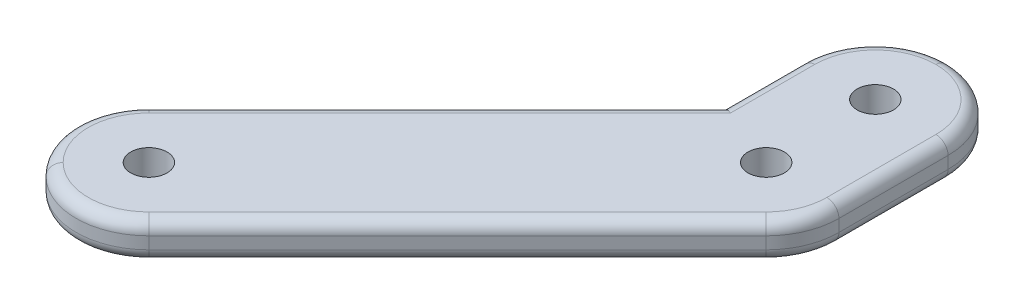
ISO-10303-21;
HEADER;
FILE_DESCRIPTION(('STEP AP214'),'2;1');
FILE_NAME('part.step','',(''),(''),'','','');
FILE_SCHEMA(('AUTOMOTIVE_DESIGN { 1 0 10303 214 1 1 1 1 }'));
ENDSEC;
DATA;
#1=APPLICATION_CONTEXT('core data for automotive mechanical design processes');
#2=APPLICATION_PROTOCOL_DEFINITION('international standard','automotive_design',2000,#1);
#3=PRODUCT_CONTEXT('',#1,'mechanical');
#4=PRODUCT('Part','Part','',(#3));
#5=PRODUCT_RELATED_PRODUCT_CATEGORY('part','',(#4));
#6=PRODUCT_DEFINITION_FORMATION('','',#4);
#7=PRODUCT_DEFINITION_CONTEXT('part definition',#1,'design');
#8=PRODUCT_DEFINITION('design','',#6,#7);
#9=PRODUCT_DEFINITION_SHAPE('','',#8);
#10=(LENGTH_UNIT() NAMED_UNIT(*) SI_UNIT(.MILLI.,.METRE.));
#11=(NAMED_UNIT(*) PLANE_ANGLE_UNIT() SI_UNIT($,.RADIAN.));
#12=(NAMED_UNIT(*) SI_UNIT($,.STERADIAN.) SOLID_ANGLE_UNIT());
#13=UNCERTAINTY_MEASURE_WITH_UNIT(LENGTH_MEASURE(1.E-05),#10,'distance_accuracy_value','');
#14=(GEOMETRIC_REPRESENTATION_CONTEXT(3) GLOBAL_UNCERTAINTY_ASSIGNED_CONTEXT((#13)) GLOBAL_UNIT_ASSIGNED_CONTEXT((#10,
#11,#12)) REPRESENTATION_CONTEXT('',''));
#15=CARTESIAN_POINT('',(0.,0.,0.));
#16=DIRECTION('',(0.,0.,1.));
#17=DIRECTION('',(1.,0.,0.));
#18=AXIS2_PLACEMENT_3D('',#15,#16,#17);
#19=CARTESIAN_POINT('',(9.25262806053457,6.35,9.25262806053447));
#20=DIRECTION('',(-0.707106781186551,0.,-0.707106781186544));
#21=DIRECTION('',(-0.707106781186544,0.,0.707106781186551));
#22=AXIS2_PLACEMENT_3D('',#19,#20,#21);
#23=PLANE('',#22);
#24=DIRECTION('',(0.,-1.,0.));
#25=VECTOR('',#24,1.);
#26=CARTESIAN_POINT('',(-44.9012806053454,6.35,63.406536726415));
#27=LINE('',#26,#25);
#28=CARTESIAN_POINT('',(-44.9012806053454,4.23333333333333,63.406536726415));
#29=VERTEX_POINT('',#28);
#30=CARTESIAN_POINT('',(-44.9012806053454,2.11666666666667,63.406536726415));
#31=VERTEX_POINT('',#30);
#32=EDGE_CURVE('E187',#29,#31,#27,.T.);
#33=ORIENTED_EDGE('',*,*,#32,.T.);
#34=DIRECTION('',(0.707106781186544,0.,-0.707106781186551));
#35=VECTOR('',#34,1.);
#36=CARTESIAN_POINT('',(9.25262806053457,2.11666666666667,9.25262806053447));
#37=LINE('',#36,#35);
#38=CARTESIAN_POINT('',(8.98025612106921,2.11666666666667,9.52499999999984));
#39=VERTEX_POINT('',#38);
#40=EDGE_CURVE('E233',#31,#39,#37,.T.);
#41=ORIENTED_EDGE('',*,*,#40,.T.);
#42=DIRECTION('',(0.,-1.,0.));
#43=VECTOR('',#42,1.);
#44=CARTESIAN_POINT('',(8.98025612106921,6.35,9.52499999999984));
#45=LINE('',#44,#43);
#46=CARTESIAN_POINT('',(8.98025612106921,4.23333333333333,9.52499999999984));
#47=VERTEX_POINT('',#46);
#48=EDGE_CURVE('E316',#47,#39,#45,.T.);
#49=ORIENTED_EDGE('',*,*,#48,.F.);
#50=DIRECTION('',(0.707106781186544,0.,-0.707106781186551));
#51=VECTOR('',#50,1.);
#52=CARTESIAN_POINT('',(-44.9012806053454,4.23333333333333,63.406536726415));
#53=LINE('',#52,#51);
#54=EDGE_CURVE('E231',#47,#29,#53,.F.);
#55=ORIENTED_EDGE('',*,*,#54,.T.);
#56=EDGE_LOOP('',(#33,#41,#49,#55));
#57=FACE_BOUND('',#56,.T.);
#58=ADVANCED_FACE('F35',(#57),#23,.F.);
#59=CARTESIAN_POINT('',(0.,6.35,0.544743878930734));
#60=DIRECTION('',(0.,-1.,0.));
#61=DIRECTION('',(0.,0.,-1.));
#62=AXIS2_PLACEMENT_3D('',#59,#60,#61);
#63=CYLINDRICAL_SURFACE('',#62,12.7);
#64=ORIENTED_EDGE('',*,*,#48,.T.);
#65=CARTESIAN_POINT('',(0.,2.11666666666667,0.544743878930734));
#66=DIRECTION('',(0.,1.,0.));
#67=DIRECTION('',(0.,0.,1.));
#68=AXIS2_PLACEMENT_3D('',#65,#66,#67);
#69=CIRCLE('',#68,12.7);
#70=CARTESIAN_POINT('',(12.7,2.11666666666667,0.544743878930734));
#71=VERTEX_POINT('',#70);
#72=EDGE_CURVE('E229',#39,#71,#69,.T.);
#73=ORIENTED_EDGE('',*,*,#72,.T.);
#74=DIRECTION('',(0.,-1.,0.));
#75=VECTOR('',#74,1.);
#76=CARTESIAN_POINT('',(12.7,6.35,0.544743878930734));
#77=LINE('',#76,#75);
#78=CARTESIAN_POINT('',(12.7,4.23333333333333,0.544743878930734));
#79=VERTEX_POINT('',#78);
#80=EDGE_CURVE('E335',#79,#71,#77,.T.);
#81=ORIENTED_EDGE('',*,*,#80,.F.);
#82=CARTESIAN_POINT('',(0.,4.23333333333333,0.544743878930734));
#83=DIRECTION('',(0.,1.,0.));
#84=DIRECTION('',(0.,0.,1.));
#85=AXIS2_PLACEMENT_3D('',#82,#83,#84);
#86=CIRCLE('',#85,12.7);
#87=EDGE_CURVE('E227',#79,#47,#86,.F.);
#88=ORIENTED_EDGE('',*,*,#87,.T.);
#89=EDGE_LOOP('',(#64,#73,#81,#88));
#90=FACE_BOUND('',#89,.T.);
#91=ADVANCED_FACE('F331',(#90),#63,.T.);
#92=CARTESIAN_POINT('',(12.7,6.35,0.));
#93=DIRECTION('',(-1.,0.,0.));
#94=DIRECTION('',(0.,0.,1.));
#95=AXIS2_PLACEMENT_3D('',#92,#93,#94);
#96=PLANE('',#95);
#97=ORIENTED_EDGE('',*,*,#80,.T.);
#98=DIRECTION('',(0.,0.,-1.));
#99=VECTOR('',#98,1.);
#100=CARTESIAN_POINT('',(12.7,2.11666666666667,0.));
#101=LINE('',#100,#99);
#102=CARTESIAN_POINT('',(12.7,2.11666666666667,-18.5052561210693));
#103=VERTEX_POINT('',#102);
#104=EDGE_CURVE('E225',#71,#103,#101,.T.);
#105=ORIENTED_EDGE('',*,*,#104,.T.);
#106=DIRECTION('',(0.,-1.,0.));
#107=VECTOR('',#106,1.);
#108=CARTESIAN_POINT('',(12.7,6.35,-18.5052561210693));
#109=LINE('',#108,#107);
#110=CARTESIAN_POINT('',(12.7,4.23333333333333,-18.5052561210693));
#111=VERTEX_POINT('',#110);
#112=EDGE_CURVE('E334',#103,#111,#109,.F.);
#113=ORIENTED_EDGE('',*,*,#112,.T.);
#114=DIRECTION('',(0.,0.,-1.));
#115=VECTOR('',#114,1.);
#116=CARTESIAN_POINT('',(12.7,4.23333333333333,0.544743878930734));
#117=LINE('',#116,#115);
#118=EDGE_CURVE('E223',#111,#79,#117,.F.);
#119=ORIENTED_EDGE('',*,*,#118,.T.);
#120=EDGE_LOOP('',(#97,#105,#113,#119));
#121=FACE_BOUND('',#120,.T.);
#122=ADVANCED_FACE('F427',(#121),#96,.F.);
#123=CARTESIAN_POINT('',(-12.7,6.35,0.));
#124=DIRECTION('',(-1.,0.,0.));
#125=DIRECTION('',(0.,0.,1.));
#126=AXIS2_PLACEMENT_3D('',#123,#124,#125);
#127=PLANE('',#126);
#128=DIRECTION('',(0.,-1.,0.));
#129=VECTOR('',#128,1.);
#130=CARTESIAN_POINT('',(-12.7,6.35,-18.5052561210693));
#131=LINE('',#130,#129);
#132=CARTESIAN_POINT('',(-12.7,4.23333333333333,-18.5052561210693));
#133=VERTEX_POINT('',#132);
#134=CARTESIAN_POINT('',(-12.7,2.11666666666667,-18.5052561210693));
#135=VERTEX_POINT('',#134);
#136=EDGE_CURVE('E338',#133,#135,#131,.T.);
#137=ORIENTED_EDGE('',*,*,#136,.T.);
#138=DIRECTION('',(0.,0.,-1.));
#139=VECTOR('',#138,1.);
#140=CARTESIAN_POINT('',(-12.7,2.11666666666667,-4.71576836320753));
#141=LINE('',#140,#139);
#142=CARTESIAN_POINT('',(-12.7,2.11666666666667,-4.71576836320753));
#143=VERTEX_POINT('',#142);
#144=EDGE_CURVE('E212',#135,#143,#141,.F.);
#145=ORIENTED_EDGE('',*,*,#144,.T.);
#146=DIRECTION('',(0.,-1.,0.));
#147=VECTOR('',#146,1.);
#148=CARTESIAN_POINT('',(-12.7,6.35,-4.71576836320753));
#149=LINE('',#148,#147);
#150=CARTESIAN_POINT('',(-12.7,4.23333333333333,-4.71576836320753));
#151=VERTEX_POINT('',#150);
#152=EDGE_CURVE('E340',#151,#143,#149,.T.);
#153=ORIENTED_EDGE('',*,*,#152,.F.);
#154=DIRECTION('',(0.,0.,-1.));
#155=VECTOR('',#154,1.);
#156=CARTESIAN_POINT('',(-12.7,4.23333333333333,0.));
#157=LINE('',#156,#155);
#158=EDGE_CURVE('E209',#151,#133,#157,.T.);
#159=ORIENTED_EDGE('',*,*,#158,.T.);
#160=EDGE_LOOP('',(#137,#145,#153,#159));
#161=FACE_BOUND('',#160,.T.);
#162=ADVANCED_FACE('F377',(#161),#127,.T.);
#163=CARTESIAN_POINT('',(-8.70788418160383,6.35,-8.70788418160373));
#164=DIRECTION('',(0.707106781186551,0.,0.707106781186544));
#165=DIRECTION('',(0.707106781186544,0.,-0.707106781186551));
#166=AXIS2_PLACEMENT_3D('',#163,#164,#165);
#167=PLANE('',#166);
#168=ORIENTED_EDGE('',*,*,#152,.T.);
#169=DIRECTION('',(-0.707106781186544,0.,0.707106781186551));
#170=VECTOR('',#169,1.);
#171=CARTESIAN_POINT('',(-8.70788418160383,2.11666666666667,-8.70788418160373));
#172=LINE('',#171,#170);
#173=CARTESIAN_POINT('',(-62.8617928474838,2.11666666666667,45.4460244842768));
#174=VERTEX_POINT('',#173);
#175=EDGE_CURVE('E11',#143,#174,#172,.T.);
#176=ORIENTED_EDGE('',*,*,#175,.T.);
#177=DIRECTION('',(0.,-1.,0.));
#178=VECTOR('',#177,1.);
#179=CARTESIAN_POINT('',(-62.8617928474838,6.35,45.4460244842768));
#180=LINE('',#179,#178);
#181=CARTESIAN_POINT('',(-62.8617928474838,4.23333333333333,45.4460244842768));
#182=VERTEX_POINT('',#181);
#183=EDGE_CURVE('E190',#174,#182,#180,.F.);
#184=ORIENTED_EDGE('',*,*,#183,.T.);
#185=DIRECTION('',(-0.707106781186544,0.,0.707106781186551));
#186=VECTOR('',#185,1.);
#187=CARTESIAN_POINT('',(-12.7,4.23333333333333,-4.71576836320753));
#188=LINE('',#187,#186);
#189=EDGE_CURVE('E44',#182,#151,#188,.F.);
#190=ORIENTED_EDGE('',*,*,#189,.T.);
#191=EDGE_LOOP('',(#168,#176,#184,#190));
#192=FACE_BOUND('',#191,.T.);
#193=ADVANCED_FACE('F375',(#192),#167,.F.);
#194=CARTESIAN_POINT('',(0.,6.35,-18.5052561210693));
#195=DIRECTION('',(0.,-1.,0.));
#196=DIRECTION('',(0.,0.,-1.));
#197=AXIS2_PLACEMENT_3D('',#194,#195,#196);
#198=CYLINDRICAL_SURFACE('',#197,3.17499999999999);
#199=CARTESIAN_POINT('',(0.,6.35,-18.5052561210693));
#200=DIRECTION('',(0.,1.,0.));
#201=DIRECTION('',(0.,0.,1.));
#202=AXIS2_PLACEMENT_3D('',#199,#200,#201);
#203=CIRCLE('',#202,3.17499999999999);
#204=CARTESIAN_POINT('',(0.,6.35,-15.3302561210693));
#205=VERTEX_POINT('',#204);
#206=EDGE_CURVE('E382',#205,#205,#203,.T.);
#207=ORIENTED_EDGE('',*,*,#206,.T.);
#208=EDGE_LOOP('',(#207));
#209=FACE_BOUND('',#208,.T.);
#210=CARTESIAN_POINT('',(0.,0.,-18.5052561210693));
#211=DIRECTION('',(0.,1.,0.));
#212=DIRECTION('',(0.,0.,1.));
#213=AXIS2_PLACEMENT_3D('',#210,#211,#212);
#214=CIRCLE('',#213,3.17499999999999);
#215=CARTESIAN_POINT('',(0.,0.,-15.3302561210693));
#216=VERTEX_POINT('',#215);
#217=EDGE_CURVE('E354',#216,#216,#214,.T.);
#218=ORIENTED_EDGE('',*,*,#217,.F.);
#219=EDGE_LOOP('',(#218));
#220=FACE_BOUND('',#219,.T.);
#221=ADVANCED_FACE('F566',(#209,#220),#198,.F.);
#222=CARTESIAN_POINT('',(-53.8815367264146,6.35,54.4262806053459));
#223=DIRECTION('',(0.,-1.,0.));
#224=DIRECTION('',(0.,0.,-1.));
#225=AXIS2_PLACEMENT_3D('',#222,#223,#224);
#226=CYLINDRICAL_SURFACE('',#225,3.175);
#227=CARTESIAN_POINT('',(-53.8815367264146,6.35,54.4262806053459));
#228=DIRECTION('',(0.,1.,0.));
#229=DIRECTION('',(0.,0.,1.));
#230=AXIS2_PLACEMENT_3D('',#227,#228,#229);
#231=CIRCLE('',#230,3.175);
#232=CARTESIAN_POINT('',(-53.8815367264146,6.35,57.6012806053459));
#233=VERTEX_POINT('',#232);
#234=EDGE_CURVE('E388',#233,#233,#231,.T.);
#235=ORIENTED_EDGE('',*,*,#234,.T.);
#236=EDGE_LOOP('',(#235));
#237=FACE_BOUND('',#236,.T.);
#238=CARTESIAN_POINT('',(-53.8815367264146,0.,54.4262806053459));
#239=DIRECTION('',(0.,1.,0.));
#240=DIRECTION('',(0.,0.,1.));
#241=AXIS2_PLACEMENT_3D('',#238,#239,#240);
#242=CIRCLE('',#241,3.175);
#243=CARTESIAN_POINT('',(-53.8815367264146,0.,57.6012806053459));
#244=VERTEX_POINT('',#243);
#245=EDGE_CURVE('E349',#244,#244,#242,.T.);
#246=ORIENTED_EDGE('',*,*,#245,.F.);
#247=EDGE_LOOP('',(#246));
#248=FACE_BOUND('',#247,.T.);
#249=ADVANCED_FACE('F396',(#237,#248),#226,.F.);
#250=CARTESIAN_POINT('',(0.,6.35,0.544743878930734));
#251=DIRECTION('',(0.,-1.,0.));
#252=DIRECTION('',(0.,0.,-1.));
#253=AXIS2_PLACEMENT_3D('',#250,#251,#252);
#254=CYLINDRICAL_SURFACE('',#253,3.17499999999999);
#255=CARTESIAN_POINT('',(0.,6.35,0.544743878930734));
#256=DIRECTION('',(0.,1.,0.));
#257=DIRECTION('',(0.,0.,1.));
#258=AXIS2_PLACEMENT_3D('',#255,#256,#257);
#259=CIRCLE('',#258,3.17499999999999);
#260=CARTESIAN_POINT('',(0.,6.35,3.71974387893073));
#261=VERTEX_POINT('',#260);
#262=EDGE_CURVE('E380',#261,#261,#259,.T.);
#263=ORIENTED_EDGE('',*,*,#262,.T.);
#264=EDGE_LOOP('',(#263));
#265=FACE_BOUND('',#264,.T.);
#266=CARTESIAN_POINT('',(0.,0.,0.544743878930734));
#267=DIRECTION('',(0.,1.,0.));
#268=DIRECTION('',(0.,0.,1.));
#269=AXIS2_PLACEMENT_3D('',#266,#267,#268);
#270=CIRCLE('',#269,3.17499999999999);
#271=CARTESIAN_POINT('',(0.,0.,3.71974387893073));
#272=VERTEX_POINT('',#271);
#273=EDGE_CURVE('E385',#272,#272,#270,.T.);
#274=ORIENTED_EDGE('',*,*,#273,.F.);
#275=EDGE_LOOP('',(#274));
#276=FACE_BOUND('',#275,.T.);
#277=ADVANCED_FACE('F402',(#265,#276),#254,.F.);
#278=CARTESIAN_POINT('',(0.,6.35,0.));
#279=DIRECTION('',(0.,1.,0.));
#280=DIRECTION('',(0.,0.,1.));
#281=AXIS2_PLACEMENT_3D('',#278,#279,#280);
#282=PLANE('',#281);
#283=CARTESIAN_POINT('',(0.,6.35,-18.5052561210693));
#284=DIRECTION('',(0.,1.,0.));
#285=DIRECTION('',(0.,0.,1.));
#286=AXIS2_PLACEMENT_3D('',#283,#284,#285);
#287=CIRCLE('',#286,10.5833333333333);
#288=CARTESIAN_POINT('',(0.,6.35,-29.0885894544026));
#289=VERTEX_POINT('',#288);
#290=CARTESIAN_POINT('',(-10.5833333333333,6.35,-18.5052561210693));
#291=VERTEX_POINT('',#290);
#292=EDGE_CURVE('E52',#289,#291,#287,.T.);
#293=ORIENTED_EDGE('',*,*,#292,.T.);
#294=DIRECTION('',(0.,0.,-1.));
#295=VECTOR('',#294,1.);
#296=CARTESIAN_POINT('',(-10.5833333333333,6.35,0.));
#297=LINE('',#296,#295);
#298=CARTESIAN_POINT('',(-10.5833333333333,6.35,-3.83901632285116));
#299=VERTEX_POINT('',#298);
#300=EDGE_CURVE('E256',#291,#299,#297,.F.);
#301=ORIENTED_EDGE('',*,*,#300,.T.);
#302=DIRECTION('',(-0.707106781186544,0.,0.707106781186551));
#303=VECTOR('',#302,1.);
#304=CARTESIAN_POINT('',(-61.3650834939723,6.35,46.9427338377884));
#305=LINE('',#304,#303);
#306=CARTESIAN_POINT('',(-61.3650834939723,6.35,46.9427338377883));
#307=VERTEX_POINT('',#306);
#308=EDGE_CURVE('E242',#299,#307,#305,.T.);
#309=ORIENTED_EDGE('',*,*,#308,.T.);
#310=CARTESIAN_POINT('',(-53.8815367264146,6.35,54.4262806053459));
#311=DIRECTION('',(0.,1.,0.));
#312=DIRECTION('',(0.,0.,1.));
#313=AXIS2_PLACEMENT_3D('',#310,#311,#312);
#314=CIRCLE('',#313,10.5833333333333);
#315=CARTESIAN_POINT('',(-61.3650834939722,6.35,61.9098273729036));
#316=VERTEX_POINT('',#315);
#317=EDGE_CURVE('E244',#307,#316,#314,.T.);
#318=ORIENTED_EDGE('',*,*,#317,.T.);
#319=CARTESIAN_POINT('',(-53.8815367264146,6.35,54.4262806053459));
#320=DIRECTION('',(0.,1.,0.));
#321=DIRECTION('',(0.,0.,1.));
#322=AXIS2_PLACEMENT_3D('',#319,#320,#321);
#323=CIRCLE('',#322,10.5833333333333);
#324=CARTESIAN_POINT('',(-46.3979899588569,6.35,61.9098273729035));
#325=VERTEX_POINT('',#324);
#326=EDGE_CURVE('E246',#316,#325,#323,.T.);
#327=ORIENTED_EDGE('',*,*,#326,.T.);
#328=DIRECTION('',(0.707106781186544,0.,-0.707106781186551));
#329=VECTOR('',#328,1.);
#330=CARTESIAN_POINT('',(7.48354676755766,6.35,8.02829064648832));
#331=LINE('',#330,#329);
#332=CARTESIAN_POINT('',(7.48354676755766,6.35,8.02829064648832));
#333=VERTEX_POINT('',#332);
#334=EDGE_CURVE('E248',#325,#333,#331,.T.);
#335=ORIENTED_EDGE('',*,*,#334,.T.);
#336=CARTESIAN_POINT('',(0.,6.35,0.544743878930734));
#337=DIRECTION('',(0.,1.,0.));
#338=DIRECTION('',(0.,0.,1.));
#339=AXIS2_PLACEMENT_3D('',#336,#337,#338);
#340=CIRCLE('',#339,10.5833333333333);
#341=CARTESIAN_POINT('',(10.5833333333333,6.35,0.544743878930735));
#342=VERTEX_POINT('',#341);
#343=EDGE_CURVE('E250',#333,#342,#340,.T.);
#344=ORIENTED_EDGE('',*,*,#343,.T.);
#345=DIRECTION('',(0.,0.,-1.));
#346=VECTOR('',#345,1.);
#347=CARTESIAN_POINT('',(10.5833333333333,6.35,-18.5052561210693));
#348=LINE('',#347,#346);
#349=CARTESIAN_POINT('',(10.5833333333333,6.35,-18.5052561210693));
#350=VERTEX_POINT('',#349);
#351=EDGE_CURVE('E252',#342,#350,#348,.T.);
#352=ORIENTED_EDGE('',*,*,#351,.T.);
#353=CARTESIAN_POINT('',(0.,6.35,-18.5052561210693));
#354=DIRECTION('',(0.,1.,0.));
#355=DIRECTION('',(0.,0.,1.));
#356=AXIS2_PLACEMENT_3D('',#353,#354,#355);
#357=CIRCLE('',#356,10.5833333333333);
#358=EDGE_CURVE('E57',#350,#289,#357,.T.);
#359=ORIENTED_EDGE('',*,*,#358,.T.);
#360=EDGE_LOOP('',(#293,#301,#309,#318,#327,#335,#344,#352,#359));
#361=FACE_BOUND('',#360,.T.);
#362=ORIENTED_EDGE('',*,*,#234,.F.);
#363=EDGE_LOOP('',(#362));
#364=FACE_BOUND('',#363,.T.);
#365=ORIENTED_EDGE('',*,*,#206,.F.);
#366=EDGE_LOOP('',(#365));
#367=FACE_BOUND('',#366,.T.);
#368=ORIENTED_EDGE('',*,*,#262,.F.);
#369=EDGE_LOOP('',(#368));
#370=FACE_BOUND('',#369,.T.);
#371=ADVANCED_FACE('F399',(#361,#364,#367,#370),#282,.T.);
#372=CARTESIAN_POINT('',(0.,0.,0.));
#373=DIRECTION('',(0.,1.,0.));
#374=DIRECTION('',(0.,0.,1.));
#375=AXIS2_PLACEMENT_3D('',#372,#373,#374);
#376=PLANE('',#375);
#377=DIRECTION('',(-0.707106781186544,0.,0.707106781186551));
#378=VECTOR('',#377,1.);
#379=CARTESIAN_POINT('',(-7.21117482809229,0.,-7.21117482809222));
#380=LINE('',#379,#378);
#381=CARTESIAN_POINT('',(-61.3650834939723,0.,46.9427338377883));
#382=VERTEX_POINT('',#381);
#383=CARTESIAN_POINT('',(-10.5833333333333,0.,-3.83901632285115));
#384=VERTEX_POINT('',#383);
#385=EDGE_CURVE('E166',#382,#384,#380,.F.);
#386=ORIENTED_EDGE('',*,*,#385,.T.);
#387=DIRECTION('',(0.,0.,-1.));
#388=VECTOR('',#387,1.);
#389=CARTESIAN_POINT('',(-10.5833333333333,0.,-18.5052561210693));
#390=LINE('',#389,#388);
#391=CARTESIAN_POINT('',(-10.5833333333333,0.,-18.5052561210693));
#392=VERTEX_POINT('',#391);
#393=EDGE_CURVE('E207',#384,#392,#390,.T.);
#394=ORIENTED_EDGE('',*,*,#393,.T.);
#395=CARTESIAN_POINT('',(0.,0.,-18.5052561210693));
#396=DIRECTION('',(0.,1.,0.));
#397=DIRECTION('',(0.,0.,1.));
#398=AXIS2_PLACEMENT_3D('',#395,#396,#397);
#399=CIRCLE('',#398,10.5833333333333);
#400=CARTESIAN_POINT('',(0.,0.,-29.0885894544026));
#401=VERTEX_POINT('',#400);
#402=EDGE_CURVE('E205',#392,#401,#399,.F.);
#403=ORIENTED_EDGE('',*,*,#402,.T.);
#404=CARTESIAN_POINT('',(0.,0.,-18.5052561210693));
#405=DIRECTION('',(0.,1.,0.));
#406=DIRECTION('',(0.,0.,1.));
#407=AXIS2_PLACEMENT_3D('',#404,#405,#406);
#408=CIRCLE('',#407,10.5833333333333);
#409=CARTESIAN_POINT('',(10.5833333333333,0.,-18.5052561210693));
#410=VERTEX_POINT('',#409);
#411=EDGE_CURVE('E203',#401,#410,#408,.F.);
#412=ORIENTED_EDGE('',*,*,#411,.T.);
#413=DIRECTION('',(0.,0.,-1.));
#414=VECTOR('',#413,1.);
#415=CARTESIAN_POINT('',(10.5833333333333,0.,0.));
#416=LINE('',#415,#414);
#417=CARTESIAN_POINT('',(10.5833333333333,0.,0.544743878930735));
#418=VERTEX_POINT('',#417);
#419=EDGE_CURVE('E201',#410,#418,#416,.F.);
#420=ORIENTED_EDGE('',*,*,#419,.T.);
#421=CARTESIAN_POINT('',(0.,0.,0.544743878930734));
#422=DIRECTION('',(0.,1.,0.));
#423=DIRECTION('',(0.,0.,1.));
#424=AXIS2_PLACEMENT_3D('',#421,#422,#423);
#425=CIRCLE('',#424,10.5833333333333);
#426=CARTESIAN_POINT('',(7.48354676755766,0.,8.02829064648832));
#427=VERTEX_POINT('',#426);
#428=EDGE_CURVE('E199',#418,#427,#425,.F.);
#429=ORIENTED_EDGE('',*,*,#428,.T.);
#430=DIRECTION('',(0.707106781186544,0.,-0.707106781186551));
#431=VECTOR('',#430,1.);
#432=CARTESIAN_POINT('',(7.75591870702303,0.,7.75591870702295));
#433=LINE('',#432,#431);
#434=CARTESIAN_POINT('',(-46.3979899588569,0.,61.9098273729035));
#435=VERTEX_POINT('',#434);
#436=EDGE_CURVE('E197',#427,#435,#433,.F.);
#437=ORIENTED_EDGE('',*,*,#436,.T.);
#438=CARTESIAN_POINT('',(-53.8815367264146,0.,54.4262806053459));
#439=DIRECTION('',(0.,1.,0.));
#440=DIRECTION('',(0.,0.,1.));
#441=AXIS2_PLACEMENT_3D('',#438,#439,#440);
#442=CIRCLE('',#441,10.5833333333333);
#443=CARTESIAN_POINT('',(-61.3650834939722,0.,61.9098273729036));
#444=VERTEX_POINT('',#443);
#445=EDGE_CURVE('E169',#435,#444,#442,.F.);
#446=ORIENTED_EDGE('',*,*,#445,.T.);
#447=CARTESIAN_POINT('',(-53.8815367264146,0.,54.4262806053459));
#448=DIRECTION('',(0.,1.,0.));
#449=DIRECTION('',(0.,0.,1.));
#450=AXIS2_PLACEMENT_3D('',#447,#448,#449);
#451=CIRCLE('',#450,10.5833333333333);
#452=EDGE_CURVE('E160',#444,#382,#451,.F.);
#453=ORIENTED_EDGE('',*,*,#452,.T.);
#454=EDGE_LOOP('',(#386,#394,#403,#412,#420,#429,#437,#446,#453));
#455=FACE_BOUND('',#454,.T.);
#456=ORIENTED_EDGE('',*,*,#245,.T.);
#457=EDGE_LOOP('',(#456));
#458=FACE_BOUND('',#457,.T.);
#459=ORIENTED_EDGE('',*,*,#217,.T.);
#460=EDGE_LOOP('',(#459));
#461=FACE_BOUND('',#460,.T.);
#462=ORIENTED_EDGE('',*,*,#273,.T.);
#463=EDGE_LOOP('',(#462));
#464=FACE_BOUND('',#463,.T.);
#465=ADVANCED_FACE('F162',(#455,#458,#461,#464),#376,.F.);
#466=CARTESIAN_POINT('',(0.,6.35,-18.5052561210693));
#467=DIRECTION('',(0.,-1.,0.));
#468=DIRECTION('',(0.,0.,-1.));
#469=AXIS2_PLACEMENT_3D('',#466,#467,#468);
#470=CYLINDRICAL_SURFACE('',#469,12.7);
#471=DIRECTION('',(0.,-1.,0.));
#472=VECTOR('',#471,1.);
#473=CARTESIAN_POINT('',(0.,6.35,-31.2052561210693));
#474=LINE('',#473,#472);
#475=CARTESIAN_POINT('',(0.,2.11666666666667,-31.2052561210693));
#476=VERTEX_POINT('',#475);
#477=CARTESIAN_POINT('',(0.,4.23333333333333,-31.2052561210693));
#478=VERTEX_POINT('',#477);
#479=EDGE_CURVE('E347',#476,#478,#474,.F.);
#480=ORIENTED_EDGE('',*,*,#479,.F.);
#481=CARTESIAN_POINT('',(0.,2.11666666666667,-18.5052561210693));
#482=DIRECTION('',(0.,1.,0.));
#483=DIRECTION('',(0.,0.,1.));
#484=AXIS2_PLACEMENT_3D('',#481,#482,#483);
#485=CIRCLE('',#484,12.7);
#486=EDGE_CURVE('E217',#476,#135,#485,.T.);
#487=ORIENTED_EDGE('',*,*,#486,.T.);
#488=ORIENTED_EDGE('',*,*,#136,.F.);
#489=CARTESIAN_POINT('',(0.,4.23333333333333,-18.5052561210693));
#490=DIRECTION('',(0.,1.,0.));
#491=DIRECTION('',(0.,0.,1.));
#492=AXIS2_PLACEMENT_3D('',#489,#490,#491);
#493=CIRCLE('',#492,12.7);
#494=EDGE_CURVE('E215',#133,#478,#493,.F.);
#495=ORIENTED_EDGE('',*,*,#494,.T.);
#496=EDGE_LOOP('',(#480,#487,#488,#495));
#497=FACE_BOUND('',#496,.T.);
#498=ADVANCED_FACE('F414',(#497),#470,.T.);
#499=CARTESIAN_POINT('',(0.,6.35,-18.5052561210693));
#500=DIRECTION('',(0.,1.,0.));
#501=DIRECTION('',(0.,0.,1.));
#502=AXIS2_PLACEMENT_3D('',#499,#500,#501);
#503=CYLINDRICAL_SURFACE('',#502,12.7);
#504=ORIENTED_EDGE('',*,*,#112,.F.);
#505=CARTESIAN_POINT('',(0.,2.11666666666667,-18.5052561210693));
#506=DIRECTION('',(0.,1.,0.));
#507=DIRECTION('',(0.,0.,1.));
#508=AXIS2_PLACEMENT_3D('',#505,#506,#507);
#509=CIRCLE('',#508,12.7);
#510=EDGE_CURVE('E221',#103,#476,#509,.T.);
#511=ORIENTED_EDGE('',*,*,#510,.T.);
#512=ORIENTED_EDGE('',*,*,#479,.T.);
#513=CARTESIAN_POINT('',(0.,4.23333333333333,-18.5052561210693));
#514=DIRECTION('',(0.,1.,0.));
#515=DIRECTION('',(0.,0.,1.));
#516=AXIS2_PLACEMENT_3D('',#513,#514,#515);
#517=CIRCLE('',#516,12.7);
#518=EDGE_CURVE('E219',#478,#111,#517,.F.);
#519=ORIENTED_EDGE('',*,*,#518,.T.);
#520=EDGE_LOOP('',(#504,#511,#512,#519));
#521=FACE_BOUND('',#520,.T.);
#522=ADVANCED_FACE('F419',(#521),#503,.T.);
#523=CARTESIAN_POINT('',(-53.8815367264146,6.35,54.4262806053459));
#524=DIRECTION('',(0.,-1.,0.));
#525=DIRECTION('',(0.,0.,-1.));
#526=AXIS2_PLACEMENT_3D('',#523,#524,#525);
#527=CYLINDRICAL_SURFACE('',#526,12.7);
#528=DIRECTION('',(0.,-1.,0.));
#529=VECTOR('',#528,1.);
#530=CARTESIAN_POINT('',(-62.8617928474837,6.35,63.4065367264151));
#531=LINE('',#530,#529);
#532=CARTESIAN_POINT('',(-62.8617928474837,2.11666666666667,63.4065367264151));
#533=VERTEX_POINT('',#532);
#534=CARTESIAN_POINT('',(-62.8617928474837,4.23333333333333,63.4065367264151));
#535=VERTEX_POINT('',#534);
#536=EDGE_CURVE('E193',#533,#535,#531,.F.);
#537=ORIENTED_EDGE('',*,*,#536,.F.);
#538=CARTESIAN_POINT('',(-53.8815367264146,2.11666666666667,54.4262806053459));
#539=DIRECTION('',(0.,1.,0.));
#540=DIRECTION('',(0.,0.,1.));
#541=AXIS2_PLACEMENT_3D('',#538,#539,#540);
#542=CIRCLE('',#541,12.7);
#543=EDGE_CURVE('E237',#533,#31,#542,.T.);
#544=ORIENTED_EDGE('',*,*,#543,.T.);
#545=ORIENTED_EDGE('',*,*,#32,.F.);
#546=CARTESIAN_POINT('',(-53.8815367264146,4.23333333333333,54.4262806053459));
#547=DIRECTION('',(0.,1.,0.));
#548=DIRECTION('',(0.,0.,1.));
#549=AXIS2_PLACEMENT_3D('',#546,#547,#548);
#550=CIRCLE('',#549,12.7);
#551=EDGE_CURVE('E235',#29,#535,#550,.F.);
#552=ORIENTED_EDGE('',*,*,#551,.T.);
#553=EDGE_LOOP('',(#537,#544,#545,#552));
#554=FACE_BOUND('',#553,.T.);
#555=ADVANCED_FACE('F319',(#554),#527,.T.);
#556=CARTESIAN_POINT('',(-53.8815367264146,6.35,54.4262806053459));
#557=DIRECTION('',(0.,-1.,0.));
#558=DIRECTION('',(0.,0.,-1.));
#559=AXIS2_PLACEMENT_3D('',#556,#557,#558);
#560=CYLINDRICAL_SURFACE('',#559,12.7);
#561=ORIENTED_EDGE('',*,*,#183,.F.);
#562=CARTESIAN_POINT('',(-53.8815367264146,2.11666666666667,54.4262806053459));
#563=DIRECTION('',(0.,1.,0.));
#564=DIRECTION('',(0.,0.,1.));
#565=AXIS2_PLACEMENT_3D('',#562,#563,#564);
#566=CIRCLE('',#565,12.7);
#567=EDGE_CURVE('E178',#174,#533,#566,.T.);
#568=ORIENTED_EDGE('',*,*,#567,.T.);
#569=ORIENTED_EDGE('',*,*,#536,.T.);
#570=CARTESIAN_POINT('',(-53.8815367264146,4.23333333333333,54.4262806053459));
#571=DIRECTION('',(0.,1.,0.));
#572=DIRECTION('',(0.,0.,1.));
#573=AXIS2_PLACEMENT_3D('',#570,#571,#572);
#574=CIRCLE('',#573,12.7);
#575=EDGE_CURVE('E239',#535,#182,#574,.F.);
#576=ORIENTED_EDGE('',*,*,#575,.T.);
#577=EDGE_LOOP('',(#561,#568,#569,#576));
#578=FACE_BOUND('',#577,.T.);
#579=ADVANCED_FACE('F359',(#578),#560,.T.);
#580=CARTESIAN_POINT('',(7.75591870702303,2.11666666666667,7.75591870702295));
#581=DIRECTION('',(0.707106781186544,0.,-0.707106781186551));
#582=DIRECTION('',(-0.707106781186551,0.,-0.707106781186544));
#583=AXIS2_PLACEMENT_3D('',#580,#581,#582);
#584=CYLINDRICAL_SURFACE('',#583,2.11666666666667);
#585=CARTESIAN_POINT('',(-46.3979899588569,2.11666666666667,61.9098273729035));
#586=DIRECTION('',(-0.707106781186544,0.,0.707106781186551));
#587=DIRECTION('',(0.707106781186551,0.,0.707106781186544));
#588=AXIS2_PLACEMENT_3D('',#585,#586,#587);
#589=CIRCLE('',#588,2.11666666666667);
#590=EDGE_CURVE('E271',#435,#31,#589,.T.);
#591=ORIENTED_EDGE('',*,*,#590,.F.);
#592=ORIENTED_EDGE('',*,*,#436,.F.);
#593=CARTESIAN_POINT('',(7.48354676755766,2.11666666666667,8.02829064648832));
#594=DIRECTION('',(0.707106781186544,0.,-0.707106781186551));
#595=DIRECTION('',(-0.707106781186551,0.,-0.707106781186544));
#596=AXIS2_PLACEMENT_3D('',#593,#594,#595);
#597=CIRCLE('',#596,2.11666666666667);
#598=EDGE_CURVE('E274',#39,#427,#597,.T.);
#599=ORIENTED_EDGE('',*,*,#598,.F.);
#600=ORIENTED_EDGE('',*,*,#40,.F.);
#601=EDGE_LOOP('',(#591,#592,#599,#600));
#602=FACE_BOUND('',#601,.T.);
#603=ADVANCED_FACE('F327',(#602),#584,.T.);
#604=CARTESIAN_POINT('',(0.,2.11666666666667,0.544743878930734));
#605=DIRECTION('',(0.,1.,0.));
#606=DIRECTION('',(0.,0.,1.));
#607=AXIS2_PLACEMENT_3D('',#604,#605,#606);
#608=TOROIDAL_SURFACE('',#607,10.5833333333333,2.11666666666667);
#609=ORIENTED_EDGE('',*,*,#598,.T.);
#610=ORIENTED_EDGE('',*,*,#428,.F.);
#611=CARTESIAN_POINT('',(10.5833333333333,2.11666666666667,0.544743878930734));
#612=DIRECTION('',(0.,0.,-1.));
#613=DIRECTION('',(0.,1.,0.));
#614=AXIS2_PLACEMENT_3D('',#611,#612,#613);
#615=CIRCLE('',#614,2.11666666666667);
#616=EDGE_CURVE('E268',#71,#418,#615,.T.);
#617=ORIENTED_EDGE('',*,*,#616,.F.);
#618=ORIENTED_EDGE('',*,*,#72,.F.);
#619=EDGE_LOOP('',(#609,#610,#617,#618));
#620=FACE_BOUND('',#619,.T.);
#621=ADVANCED_FACE('F459',(#620),#608,.T.);
#622=CARTESIAN_POINT('',(-53.8815367264146,2.11666666666667,54.4262806053459));
#623=DIRECTION('',(0.,1.,0.));
#624=DIRECTION('',(0.,0.,1.));
#625=AXIS2_PLACEMENT_3D('',#622,#623,#624);
#626=TOROIDAL_SURFACE('',#625,10.5833333333333,2.11666666666667);
#627=ORIENTED_EDGE('',*,*,#590,.T.);
#628=ORIENTED_EDGE('',*,*,#543,.F.);
#629=CARTESIAN_POINT('',(-61.3650834939722,2.11666666666667,61.9098273729036));
#630=DIRECTION('',(-0.707106781186551,0.,-0.707106781186544));
#631=DIRECTION('',(-0.707106781186544,0.,0.707106781186551));
#632=AXIS2_PLACEMENT_3D('',#629,#630,#631);
#633=CIRCLE('',#632,2.11666666666667);
#634=EDGE_CURVE('E266',#444,#533,#633,.T.);
#635=ORIENTED_EDGE('',*,*,#634,.F.);
#636=ORIENTED_EDGE('',*,*,#445,.F.);
#637=EDGE_LOOP('',(#627,#628,#635,#636));
#638=FACE_BOUND('',#637,.T.);
#639=ADVANCED_FACE('F323',(#638),#626,.T.);
#640=CARTESIAN_POINT('',(10.5833333333333,2.11666666666667,0.));
#641=DIRECTION('',(0.,0.,-1.));
#642=DIRECTION('',(-1.,0.,0.));
#643=AXIS2_PLACEMENT_3D('',#640,#641,#642);
#644=CYLINDRICAL_SURFACE('',#643,2.11666666666667);
#645=ORIENTED_EDGE('',*,*,#616,.T.);
#646=ORIENTED_EDGE('',*,*,#419,.F.);
#647=CARTESIAN_POINT('',(10.5833333333333,2.11666666666667,-18.5052561210693));
#648=DIRECTION('',(0.,0.,-1.));
#649=DIRECTION('',(-1.,0.,0.));
#650=AXIS2_PLACEMENT_3D('',#647,#648,#649);
#651=CIRCLE('',#650,2.11666666666667);
#652=EDGE_CURVE('E181',#103,#410,#651,.T.);
#653=ORIENTED_EDGE('',*,*,#652,.F.);
#654=ORIENTED_EDGE('',*,*,#104,.F.);
#655=EDGE_LOOP('',(#645,#646,#653,#654));
#656=FACE_BOUND('',#655,.T.);
#657=ADVANCED_FACE('F453',(#656),#644,.T.);
#658=CARTESIAN_POINT('',(-53.8815367264146,2.11666666666667,54.4262806053459));
#659=DIRECTION('',(0.,1.,0.));
#660=DIRECTION('',(0.,0.,1.));
#661=AXIS2_PLACEMENT_3D('',#658,#659,#660);
#662=TOROIDAL_SURFACE('',#661,10.5833333333333,2.11666666666667);
#663=ORIENTED_EDGE('',*,*,#634,.T.);
#664=ORIENTED_EDGE('',*,*,#567,.F.);
#665=CARTESIAN_POINT('',(-61.3650834939723,2.11666666666667,46.9427338377883));
#666=DIRECTION('',(0.707106781186546,0.,-0.707106781186549));
#667=DIRECTION('',(-0.707106781186549,0.,-0.707106781186546));
#668=AXIS2_PLACEMENT_3D('',#665,#666,#667);
#669=CIRCLE('',#668,2.11666666666667);
#670=EDGE_CURVE('E176',#382,#174,#669,.T.);
#671=ORIENTED_EDGE('',*,*,#670,.F.);
#672=ORIENTED_EDGE('',*,*,#452,.F.);
#673=EDGE_LOOP('',(#663,#664,#671,#672));
#674=FACE_BOUND('',#673,.T.);
#675=ADVANCED_FACE('F177',(#674),#662,.T.);
#676=CARTESIAN_POINT('',(0.,2.11666666666667,-18.5052561210693));
#677=DIRECTION('',(0.,1.,0.));
#678=DIRECTION('',(0.,0.,1.));
#679=AXIS2_PLACEMENT_3D('',#676,#677,#678);
#680=TOROIDAL_SURFACE('',#679,10.5833333333333,2.11666666666667);
#681=ORIENTED_EDGE('',*,*,#652,.T.);
#682=ORIENTED_EDGE('',*,*,#411,.F.);
#683=CARTESIAN_POINT('',(0.,2.11666666666667,-29.0885894544026));
#684=DIRECTION('',(-1.,0.,0.));
#685=DIRECTION('',(0.,-1.,0.));
#686=AXIS2_PLACEMENT_3D('',#683,#684,#685);
#687=CIRCLE('',#686,2.11666666666667);
#688=EDGE_CURVE('E182',#476,#401,#687,.T.);
#689=ORIENTED_EDGE('',*,*,#688,.F.);
#690=ORIENTED_EDGE('',*,*,#510,.F.);
#691=EDGE_LOOP('',(#681,#682,#689,#690));
#692=FACE_BOUND('',#691,.T.);
#693=ADVANCED_FACE('F447',(#692),#680,.T.);
#694=CARTESIAN_POINT('',(-7.21117482809229,2.11666666666667,-7.21117482809222));
#695=DIRECTION('',(-0.707106781186544,0.,0.707106781186551));
#696=DIRECTION('',(0.707106781186551,0.,0.707106781186544));
#697=AXIS2_PLACEMENT_3D('',#694,#695,#696);
#698=CYLINDRICAL_SURFACE('',#697,2.11666666666667);
#699=ORIENTED_EDGE('',*,*,#670,.T.);
#700=ORIENTED_EDGE('',*,*,#175,.F.);
#701=CARTESIAN_POINT('',(-10.5833333333333,2.11666666666667,-3.83901632285115));
#702=DIRECTION('',(-0.382683432365087,0.,0.923879532511288));
#703=DIRECTION('',(0.923879532511288,0.,0.382683432365087));
#704=AXIS2_PLACEMENT_3D('',#701,#702,#703);
#705=ELLIPSE('',#704,2.2910634906189,2.11666666666667);
#706=EDGE_CURVE('E185',#384,#143,#705,.F.);
#707=ORIENTED_EDGE('',*,*,#706,.F.);
#708=ORIENTED_EDGE('',*,*,#385,.F.);
#709=EDGE_LOOP('',(#699,#700,#707,#708));
#710=FACE_BOUND('',#709,.T.);
#711=ADVANCED_FACE('F184',(#710),#698,.T.);
#712=CARTESIAN_POINT('',(0.,2.11666666666667,-18.5052561210693));
#713=DIRECTION('',(0.,1.,0.));
#714=DIRECTION('',(0.,0.,1.));
#715=AXIS2_PLACEMENT_3D('',#712,#713,#714);
#716=TOROIDAL_SURFACE('',#715,10.5833333333333,2.11666666666667);
#717=ORIENTED_EDGE('',*,*,#688,.T.);
#718=ORIENTED_EDGE('',*,*,#402,.F.);
#719=CARTESIAN_POINT('',(-10.5833333333333,2.11666666666667,-18.5052561210693));
#720=DIRECTION('',(0.,0.,1.));
#721=DIRECTION('',(1.,0.,0.));
#722=AXIS2_PLACEMENT_3D('',#719,#720,#721);
#723=CIRCLE('',#722,2.11666666666667);
#724=EDGE_CURVE('E259',#135,#392,#723,.T.);
#725=ORIENTED_EDGE('',*,*,#724,.F.);
#726=ORIENTED_EDGE('',*,*,#486,.F.);
#727=EDGE_LOOP('',(#717,#718,#725,#726));
#728=FACE_BOUND('',#727,.T.);
#729=ADVANCED_FACE('F440',(#728),#716,.T.);
#730=CARTESIAN_POINT('',(-10.5833333333333,2.11666666666667,0.));
#731=DIRECTION('',(0.,0.,1.));
#732=DIRECTION('',(1.,0.,0.));
#733=AXIS2_PLACEMENT_3D('',#730,#731,#732);
#734=CYLINDRICAL_SURFACE('',#733,2.11666666666667);
#735=ORIENTED_EDGE('',*,*,#706,.T.);
#736=ORIENTED_EDGE('',*,*,#144,.F.);
#737=ORIENTED_EDGE('',*,*,#724,.T.);
#738=ORIENTED_EDGE('',*,*,#393,.F.);
#739=EDGE_LOOP('',(#735,#736,#737,#738));
#740=FACE_BOUND('',#739,.T.);
#741=ADVANCED_FACE('F437',(#740),#734,.T.);
#742=CARTESIAN_POINT('',(7.75591870702303,4.23333333333333,7.75591870702295));
#743=DIRECTION('',(-0.707106781186544,0.,0.707106781186551));
#744=DIRECTION('',(0.707106781186551,0.,0.707106781186544));
#745=AXIS2_PLACEMENT_3D('',#742,#743,#744);
#746=CYLINDRICAL_SURFACE('',#745,2.11666666666667);
#747=CARTESIAN_POINT('',(-46.3979899588569,4.23333333333333,61.9098273729035));
#748=DIRECTION('',(-0.707106781186544,0.,0.707106781186551));
#749=DIRECTION('',(0.707106781186551,0.,0.707106781186544));
#750=AXIS2_PLACEMENT_3D('',#747,#748,#749);
#751=CIRCLE('',#750,2.11666666666667);
#752=EDGE_CURVE('E295',#29,#325,#751,.T.);
#753=ORIENTED_EDGE('',*,*,#752,.F.);
#754=ORIENTED_EDGE('',*,*,#54,.F.);
#755=CARTESIAN_POINT('',(7.48354676755766,4.23333333333333,8.02829064648832));
#756=DIRECTION('',(0.707106781186544,0.,-0.707106781186551));
#757=DIRECTION('',(-0.707106781186551,0.,-0.707106781186544));
#758=AXIS2_PLACEMENT_3D('',#755,#756,#757);
#759=CIRCLE('',#758,2.11666666666667);
#760=EDGE_CURVE('E39',#333,#47,#759,.T.);
#761=ORIENTED_EDGE('',*,*,#760,.F.);
#762=ORIENTED_EDGE('',*,*,#334,.F.);
#763=EDGE_LOOP('',(#753,#754,#761,#762));
#764=FACE_BOUND('',#763,.T.);
#765=ADVANCED_FACE('F37',(#764),#746,.T.);
#766=CARTESIAN_POINT('',(0.,4.23333333333333,0.544743878930734));
#767=DIRECTION('',(0.,1.,0.));
#768=DIRECTION('',(0.,0.,1.));
#769=AXIS2_PLACEMENT_3D('',#766,#767,#768);
#770=TOROIDAL_SURFACE('',#769,10.5833333333333,2.11666666666667);
#771=ORIENTED_EDGE('',*,*,#760,.T.);
#772=ORIENTED_EDGE('',*,*,#87,.F.);
#773=CARTESIAN_POINT('',(10.5833333333333,4.23333333333333,0.544743878930735));
#774=DIRECTION('',(0.,0.,-1.));
#775=DIRECTION('',(-1.,0.,0.));
#776=AXIS2_PLACEMENT_3D('',#773,#774,#775);
#777=CIRCLE('',#776,2.11666666666667);
#778=EDGE_CURVE('E293',#342,#79,#777,.T.);
#779=ORIENTED_EDGE('',*,*,#778,.F.);
#780=ORIENTED_EDGE('',*,*,#343,.F.);
#781=EDGE_LOOP('',(#771,#772,#779,#780));
#782=FACE_BOUND('',#781,.T.);
#783=ADVANCED_FACE('F306',(#782),#770,.T.);
#784=CARTESIAN_POINT('',(-53.8815367264146,4.23333333333333,54.4262806053459));
#785=DIRECTION('',(0.,1.,0.));
#786=DIRECTION('',(0.,0.,1.));
#787=AXIS2_PLACEMENT_3D('',#784,#785,#786);
#788=TOROIDAL_SURFACE('',#787,10.5833333333333,2.11666666666667);
#789=ORIENTED_EDGE('',*,*,#752,.T.);
#790=ORIENTED_EDGE('',*,*,#326,.F.);
#791=CARTESIAN_POINT('',(-61.3650834939722,4.23333333333333,61.9098273729036));
#792=DIRECTION('',(-0.707106781186551,0.,-0.707106781186544));
#793=DIRECTION('',(-0.707106781186544,0.,0.707106781186551));
#794=AXIS2_PLACEMENT_3D('',#791,#792,#793);
#795=CIRCLE('',#794,2.11666666666667);
#796=EDGE_CURVE('E290',#535,#316,#795,.T.);
#797=ORIENTED_EDGE('',*,*,#796,.F.);
#798=ORIENTED_EDGE('',*,*,#551,.F.);
#799=EDGE_LOOP('',(#789,#790,#797,#798));
#800=FACE_BOUND('',#799,.T.);
#801=ADVANCED_FACE('F361',(#800),#788,.T.);
#802=CARTESIAN_POINT('',(10.5833333333333,4.23333333333333,0.));
#803=DIRECTION('',(0.,0.,1.));
#804=DIRECTION('',(1.,0.,0.));
#805=AXIS2_PLACEMENT_3D('',#802,#803,#804);
#806=CYLINDRICAL_SURFACE('',#805,2.11666666666667);
#807=ORIENTED_EDGE('',*,*,#778,.T.);
#808=ORIENTED_EDGE('',*,*,#118,.F.);
#809=CARTESIAN_POINT('',(10.5833333333333,4.23333333333333,-18.5052561210693));
#810=DIRECTION('',(0.,0.,-1.));
#811=DIRECTION('',(-1.,0.,0.));
#812=AXIS2_PLACEMENT_3D('',#809,#810,#811);
#813=CIRCLE('',#812,2.11666666666667);
#814=EDGE_CURVE('E287',#350,#111,#813,.T.);
#815=ORIENTED_EDGE('',*,*,#814,.F.);
#816=ORIENTED_EDGE('',*,*,#351,.F.);
#817=EDGE_LOOP('',(#807,#808,#815,#816));
#818=FACE_BOUND('',#817,.T.);
#819=ADVANCED_FACE('F481',(#818),#806,.T.);
#820=CARTESIAN_POINT('',(-53.8815367264146,4.23333333333333,54.4262806053459));
#821=DIRECTION('',(0.,1.,0.));
#822=DIRECTION('',(0.,0.,1.));
#823=AXIS2_PLACEMENT_3D('',#820,#821,#822);
#824=TOROIDAL_SURFACE('',#823,10.5833333333333,2.11666666666667);
#825=ORIENTED_EDGE('',*,*,#796,.T.);
#826=ORIENTED_EDGE('',*,*,#317,.F.);
#827=CARTESIAN_POINT('',(-61.3650834939723,4.23333333333333,46.9427338377883));
#828=DIRECTION('',(0.707106781186544,0.,-0.707106781186551));
#829=DIRECTION('',(-0.707106781186551,0.,-0.707106781186544));
#830=AXIS2_PLACEMENT_3D('',#827,#828,#829);
#831=CIRCLE('',#830,2.11666666666667);
#832=EDGE_CURVE('E284',#182,#307,#831,.T.);
#833=ORIENTED_EDGE('',*,*,#832,.F.);
#834=ORIENTED_EDGE('',*,*,#575,.F.);
#835=EDGE_LOOP('',(#825,#826,#833,#834));
#836=FACE_BOUND('',#835,.T.);
#837=ADVANCED_FACE('F365',(#836),#824,.T.);
#838=CARTESIAN_POINT('',(0.,4.23333333333333,-18.5052561210693));
#839=DIRECTION('',(0.,1.,0.));
#840=DIRECTION('',(0.,0.,1.));
#841=AXIS2_PLACEMENT_3D('',#838,#839,#840);
#842=TOROIDAL_SURFACE('',#841,10.5833333333333,2.11666666666667);
#843=ORIENTED_EDGE('',*,*,#814,.T.);
#844=ORIENTED_EDGE('',*,*,#518,.F.);
#845=CARTESIAN_POINT('',(0.,4.23333333333333,-29.0885894544026));
#846=DIRECTION('',(-1.,0.,0.));
#847=DIRECTION('',(0.,0.,1.));
#848=AXIS2_PLACEMENT_3D('',#845,#846,#847);
#849=CIRCLE('',#848,2.11666666666667);
#850=EDGE_CURVE('E281',#289,#478,#849,.T.);
#851=ORIENTED_EDGE('',*,*,#850,.F.);
#852=ORIENTED_EDGE('',*,*,#358,.F.);
#853=EDGE_LOOP('',(#843,#844,#851,#852));
#854=FACE_BOUND('',#853,.T.);
#855=ADVANCED_FACE('F475',(#854),#842,.T.);
#856=CARTESIAN_POINT('',(-7.21117482809229,4.23333333333333,-7.21117482809222));
#857=DIRECTION('',(0.707106781186544,0.,-0.707106781186551));
#858=DIRECTION('',(-0.707106781186551,0.,-0.707106781186544));
#859=AXIS2_PLACEMENT_3D('',#856,#857,#858);
#860=CYLINDRICAL_SURFACE('',#859,2.11666666666667);
#861=ORIENTED_EDGE('',*,*,#832,.T.);
#862=ORIENTED_EDGE('',*,*,#308,.F.);
#863=CARTESIAN_POINT('',(-10.5833333333333,4.23333333333333,-3.83901632285115));
#864=DIRECTION('',(0.382683432365087,0.,-0.923879532511288));
#865=DIRECTION('',(-0.923879532511288,0.,-0.382683432365087));
#866=AXIS2_PLACEMENT_3D('',#863,#864,#865);
#867=ELLIPSE('',#866,2.2910634906189,2.11666666666667);
#868=EDGE_CURVE('E279',#151,#299,#867,.T.);
#869=ORIENTED_EDGE('',*,*,#868,.F.);
#870=ORIENTED_EDGE('',*,*,#189,.F.);
#871=EDGE_LOOP('',(#861,#862,#869,#870));
#872=FACE_BOUND('',#871,.T.);
#873=ADVANCED_FACE('F370',(#872),#860,.T.);
#874=CARTESIAN_POINT('',(0.,4.23333333333333,-18.5052561210693));
#875=DIRECTION('',(0.,1.,0.));
#876=DIRECTION('',(0.,0.,1.));
#877=AXIS2_PLACEMENT_3D('',#874,#875,#876);
#878=TOROIDAL_SURFACE('',#877,10.5833333333333,2.11666666666667);
#879=ORIENTED_EDGE('',*,*,#850,.T.);
#880=ORIENTED_EDGE('',*,*,#494,.F.);
#881=CARTESIAN_POINT('',(-10.5833333333333,4.23333333333333,-18.5052561210693));
#882=DIRECTION('',(0.,0.,1.));
#883=DIRECTION('',(1.,0.,0.));
#884=AXIS2_PLACEMENT_3D('',#881,#882,#883);
#885=CIRCLE('',#884,2.11666666666667);
#886=EDGE_CURVE('E277',#291,#133,#885,.T.);
#887=ORIENTED_EDGE('',*,*,#886,.F.);
#888=ORIENTED_EDGE('',*,*,#292,.F.);
#889=EDGE_LOOP('',(#879,#880,#887,#888));
#890=FACE_BOUND('',#889,.T.);
#891=ADVANCED_FACE('F468',(#890),#878,.T.);
#892=CARTESIAN_POINT('',(-10.5833333333333,4.23333333333333,0.));
#893=DIRECTION('',(0.,0.,-1.));
#894=DIRECTION('',(-1.,0.,0.));
#895=AXIS2_PLACEMENT_3D('',#892,#893,#894);
#896=CYLINDRICAL_SURFACE('',#895,2.11666666666667);
#897=ORIENTED_EDGE('',*,*,#868,.T.);
#898=ORIENTED_EDGE('',*,*,#300,.F.);
#899=ORIENTED_EDGE('',*,*,#886,.T.);
#900=ORIENTED_EDGE('',*,*,#158,.F.);
#901=EDGE_LOOP('',(#897,#898,#899,#900));
#902=FACE_BOUND('',#901,.T.);
#903=ADVANCED_FACE('F465',(#902),#896,.T.);
#904=CLOSED_SHELL('',(#58,#91,#122,#162,#193,#221,#249,#277,#371,#465,#498,#522,#555,#579,#603,
#621,#639,#657,#675,#693,#711,#729,#741,#765,#783,#801,#819,#837,#855,#873,#891,#903));
#905=MANIFOLD_SOLID_BREP('B2',#904);
#906=ADVANCED_BREP_SHAPE_REPRESENTATION('',(#18,#905),#14);
#907=SHAPE_DEFINITION_REPRESENTATION(#9,#906);
ENDSEC;
END-ISO-10303-21;
